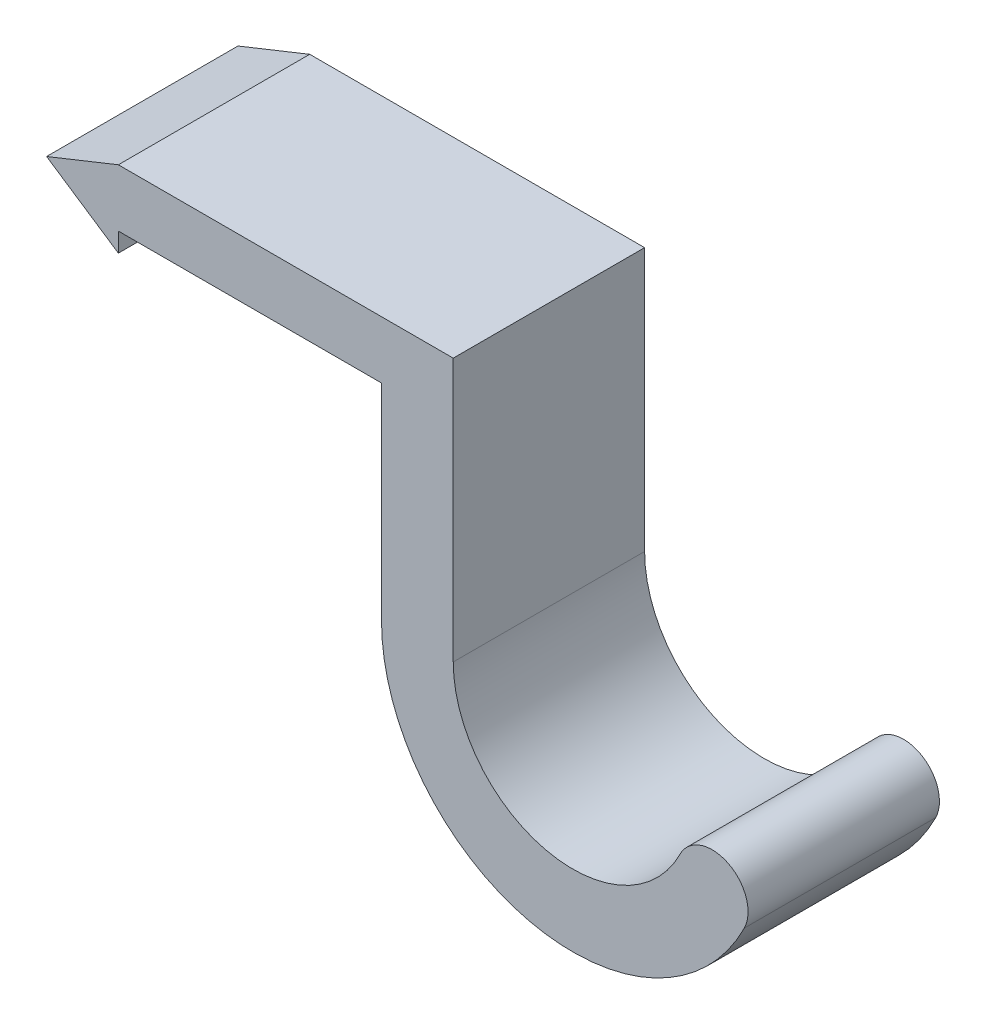
ISO-10303-21;
HEADER;
FILE_DESCRIPTION(('STEP AP214'),'2;1');
FILE_NAME('part.step','',(''),(''),'','','');
FILE_SCHEMA(('AUTOMOTIVE_DESIGN { 1 0 10303 214 1 1 1 1 }'));
ENDSEC;
DATA;
#1=APPLICATION_CONTEXT('core data for automotive mechanical design processes');
#2=APPLICATION_PROTOCOL_DEFINITION('international standard','automotive_design',2000,#1);
#3=PRODUCT_CONTEXT('',#1,'mechanical');
#4=PRODUCT('Part','Part','',(#3));
#5=PRODUCT_RELATED_PRODUCT_CATEGORY('part','',(#4));
#6=PRODUCT_DEFINITION_FORMATION('','',#4);
#7=PRODUCT_DEFINITION_CONTEXT('part definition',#1,'design');
#8=PRODUCT_DEFINITION('design','',#6,#7);
#9=PRODUCT_DEFINITION_SHAPE('','',#8);
#10=(LENGTH_UNIT() NAMED_UNIT(*) SI_UNIT(.MILLI.,.METRE.));
#11=(NAMED_UNIT(*) PLANE_ANGLE_UNIT() SI_UNIT($,.RADIAN.));
#12=(NAMED_UNIT(*) SI_UNIT($,.STERADIAN.) SOLID_ANGLE_UNIT());
#13=UNCERTAINTY_MEASURE_WITH_UNIT(LENGTH_MEASURE(1.E-05),#10,'distance_accuracy_value','');
#14=(GEOMETRIC_REPRESENTATION_CONTEXT(3) GLOBAL_UNCERTAINTY_ASSIGNED_CONTEXT((#13)) GLOBAL_UNIT_ASSIGNED_CONTEXT((#10,
#11,#12)) REPRESENTATION_CONTEXT('',''));
#15=CARTESIAN_POINT('',(0.,0.,0.));
#16=DIRECTION('',(0.,0.,1.));
#17=DIRECTION('',(1.,0.,0.));
#18=AXIS2_PLACEMENT_3D('',#15,#16,#17);
#19=CARTESIAN_POINT('',(0.,0.,40.));
#20=DIRECTION('',(-1.,0.,0.));
#21=DIRECTION('',(0.,-1.,0.));
#22=AXIS2_PLACEMENT_3D('',#19,#20,#21);
#23=PLANE('',#22);
#24=DIRECTION('',(0.,1.,0.));
#25=VECTOR('',#24,1.);
#26=CARTESIAN_POINT('',(0.,0.,0.));
#27=LINE('',#26,#25);
#28=CARTESIAN_POINT('',(0.,-4.,0.));
#29=VERTEX_POINT('',#28);
#30=CARTESIAN_POINT('',(0.,0.,0.));
#31=VERTEX_POINT('',#30);
#32=EDGE_CURVE('E145',#29,#31,#27,.T.);
#33=ORIENTED_EDGE('',*,*,#32,.T.);
#34=DIRECTION('',(0.,0.,-1.));
#35=VECTOR('',#34,1.);
#36=CARTESIAN_POINT('',(0.,0.,40.));
#37=LINE('',#36,#35);
#38=CARTESIAN_POINT('',(0.,0.,40.));
#39=VERTEX_POINT('',#38);
#40=EDGE_CURVE('E11',#39,#31,#37,.T.);
#41=ORIENTED_EDGE('',*,*,#40,.F.);
#42=DIRECTION('',(0.,1.,0.));
#43=VECTOR('',#42,1.);
#44=CARTESIAN_POINT('',(0.,0.,40.));
#45=LINE('',#44,#43);
#46=CARTESIAN_POINT('',(0.,-4.,40.));
#47=VERTEX_POINT('',#46);
#48=EDGE_CURVE('E163',#47,#39,#45,.T.);
#49=ORIENTED_EDGE('',*,*,#48,.F.);
#50=DIRECTION('',(0.,0.,-1.));
#51=VECTOR('',#50,1.);
#52=CARTESIAN_POINT('',(0.,-4.,40.));
#53=LINE('',#52,#51);
#54=EDGE_CURVE('E141',#47,#29,#53,.T.);
#55=ORIENTED_EDGE('',*,*,#54,.T.);
#56=EDGE_LOOP('',(#33,#41,#49,#55));
#57=FACE_BOUND('',#56,.T.);
#58=ADVANCED_FACE('F37',(#57),#23,.F.);
#59=CARTESIAN_POINT('',(0.,0.,40.));
#60=DIRECTION('',(0.,1.,0.));
#61=DIRECTION('',(0.,0.,1.));
#62=AXIS2_PLACEMENT_3D('',#59,#60,#61);
#63=PLANE('',#62);
#64=DIRECTION('',(1.,0.,0.));
#65=VECTOR('',#64,1.);
#66=CARTESIAN_POINT('',(0.,0.,0.));
#67=LINE('',#66,#65);
#68=CARTESIAN_POINT('',(55.,0.,0.));
#69=VERTEX_POINT('',#68);
#70=EDGE_CURVE('E148',#31,#69,#67,.T.);
#71=ORIENTED_EDGE('',*,*,#70,.T.);
#72=DIRECTION('',(0.,0.,-1.));
#73=VECTOR('',#72,1.);
#74=CARTESIAN_POINT('',(55.,0.,40.));
#75=LINE('',#74,#73);
#76=CARTESIAN_POINT('',(55.,0.,40.));
#77=VERTEX_POINT('',#76);
#78=EDGE_CURVE('E45',#77,#69,#75,.T.);
#79=ORIENTED_EDGE('',*,*,#78,.F.);
#80=DIRECTION('',(1.,0.,0.));
#81=VECTOR('',#80,1.);
#82=CARTESIAN_POINT('',(0.,0.,40.));
#83=LINE('',#82,#81);
#84=EDGE_CURVE('E102',#39,#77,#83,.T.);
#85=ORIENTED_EDGE('',*,*,#84,.F.);
#86=ORIENTED_EDGE('',*,*,#40,.T.);
#87=EDGE_LOOP('',(#71,#79,#85,#86));
#88=FACE_BOUND('',#87,.T.);
#89=ADVANCED_FACE('F212',(#88),#63,.F.);
#90=CARTESIAN_POINT('',(55.,0.,40.));
#91=DIRECTION('',(1.,0.,0.));
#92=DIRECTION('',(0.,0.,-1.));
#93=AXIS2_PLACEMENT_3D('',#90,#91,#92);
#94=PLANE('',#93);
#95=DIRECTION('',(0.,-1.,0.));
#96=VECTOR('',#95,1.);
#97=CARTESIAN_POINT('',(55.,0.,0.));
#98=LINE('',#97,#96);
#99=CARTESIAN_POINT('',(55.,-43.,0.));
#100=VERTEX_POINT('',#99);
#101=EDGE_CURVE('E150',#69,#100,#98,.T.);
#102=ORIENTED_EDGE('',*,*,#101,.T.);
#103=DIRECTION('',(0.,0.,-1.));
#104=VECTOR('',#103,1.);
#105=CARTESIAN_POINT('',(55.,-43.,40.));
#106=LINE('',#105,#104);
#107=CARTESIAN_POINT('',(55.,-43.,40.));
#108=VERTEX_POINT('',#107);
#109=EDGE_CURVE('E176',#108,#100,#106,.T.);
#110=ORIENTED_EDGE('',*,*,#109,.F.);
#111=DIRECTION('',(0.,-1.,0.));
#112=VECTOR('',#111,1.);
#113=CARTESIAN_POINT('',(55.,0.,40.));
#114=LINE('',#113,#112);
#115=EDGE_CURVE('E184',#77,#108,#114,.T.);
#116=ORIENTED_EDGE('',*,*,#115,.F.);
#117=ORIENTED_EDGE('',*,*,#78,.T.);
#118=EDGE_LOOP('',(#102,#110,#116,#117));
#119=FACE_BOUND('',#118,.T.);
#120=ADVANCED_FACE('F182',(#119),#94,.F.);
#121=CARTESIAN_POINT('',(95.,-43.,40.));
#122=DIRECTION('',(0.,0.,-1.));
#123=DIRECTION('',(-1.,0.,0.));
#124=AXIS2_PLACEMENT_3D('',#121,#122,#123);
#125=CYLINDRICAL_SURFACE('',#124,40.);
#126=CARTESIAN_POINT('',(95.,-43.,0.));
#127=DIRECTION('',(0.,0.,1.));
#128=DIRECTION('',(1.,0.,0.));
#129=AXIS2_PLACEMENT_3D('',#126,#127,#128);
#130=CIRCLE('',#129,40.);
#131=CARTESIAN_POINT('',(130.843778302859,-60.7545362365644,0.));
#132=VERTEX_POINT('',#131);
#133=EDGE_CURVE('E152',#100,#132,#130,.T.);
#134=ORIENTED_EDGE('',*,*,#133,.T.);
#135=DIRECTION('',(0.,0.,-1.));
#136=VECTOR('',#135,1.);
#137=CARTESIAN_POINT('',(130.843778302859,-60.7545362365644,40.));
#138=LINE('',#137,#136);
#139=CARTESIAN_POINT('',(130.843778302859,-60.7545362365644,40.));
#140=VERTEX_POINT('',#139);
#141=EDGE_CURVE('E173',#140,#132,#138,.T.);
#142=ORIENTED_EDGE('',*,*,#141,.F.);
#143=CARTESIAN_POINT('',(95.,-43.,40.));
#144=DIRECTION('',(0.,0.,1.));
#145=DIRECTION('',(1.,0.,0.));
#146=AXIS2_PLACEMENT_3D('',#143,#144,#145);
#147=CIRCLE('',#146,40.);
#148=EDGE_CURVE('E202',#108,#140,#147,.T.);
#149=ORIENTED_EDGE('',*,*,#148,.F.);
#150=ORIENTED_EDGE('',*,*,#109,.T.);
#151=EDGE_LOOP('',(#134,#142,#149,#150));
#152=FACE_BOUND('',#151,.T.);
#153=ADVANCED_FACE('F193',(#152),#125,.T.);
#154=CARTESIAN_POINT('',(124.123069871073,-57.4255606922085,40.));
#155=DIRECTION('',(0.,0.,-1.));
#156=DIRECTION('',(-1.,0.,0.));
#157=AXIS2_PLACEMENT_3D('',#154,#155,#156);
#158=CYLINDRICAL_SURFACE('',#157,7.50000000000001);
#159=CARTESIAN_POINT('',(124.123069871073,-57.4255606922085,0.));
#160=DIRECTION('',(0.,0.,1.));
#161=DIRECTION('',(-1.,0.,0.));
#162=AXIS2_PLACEMENT_3D('',#159,#160,#161);
#163=CIRCLE('',#162,7.50000000000001);
#164=CARTESIAN_POINT('',(117.402361439287,-54.0965851478527,0.));
#165=VERTEX_POINT('',#164);
#166=EDGE_CURVE('E154',#132,#165,#163,.T.);
#167=ORIENTED_EDGE('',*,*,#166,.T.);
#168=DIRECTION('',(0.,0.,-1.));
#169=VECTOR('',#168,1.);
#170=CARTESIAN_POINT('',(117.402361439287,-54.0965851478527,40.));
#171=LINE('',#170,#169);
#172=CARTESIAN_POINT('',(117.402361439287,-54.0965851478527,40.));
#173=VERTEX_POINT('',#172);
#174=EDGE_CURVE('E170',#173,#165,#171,.T.);
#175=ORIENTED_EDGE('',*,*,#174,.F.);
#176=CARTESIAN_POINT('',(124.123069871073,-57.4255606922085,40.));
#177=DIRECTION('',(0.,0.,1.));
#178=DIRECTION('',(-1.,0.,0.));
#179=AXIS2_PLACEMENT_3D('',#176,#177,#178);
#180=CIRCLE('',#179,7.50000000000001);
#181=EDGE_CURVE('E199',#140,#173,#180,.T.);
#182=ORIENTED_EDGE('',*,*,#181,.F.);
#183=ORIENTED_EDGE('',*,*,#141,.T.);
#184=EDGE_LOOP('',(#167,#175,#182,#183));
#185=FACE_BOUND('',#184,.T.);
#186=ADVANCED_FACE('F197',(#185),#158,.T.);
#187=CARTESIAN_POINT('',(95.,-43.,40.));
#188=DIRECTION('',(0.,0.,-1.));
#189=DIRECTION('',(-1.,0.,0.));
#190=AXIS2_PLACEMENT_3D('',#187,#188,#189);
#191=CYLINDRICAL_SURFACE('',#190,25.);
#192=CARTESIAN_POINT('',(95.,-43.,0.));
#193=DIRECTION('',(0.,0.,-1.));
#194=DIRECTION('',(1.,0.,0.));
#195=AXIS2_PLACEMENT_3D('',#192,#193,#194);
#196=CIRCLE('',#195,25.);
#197=CARTESIAN_POINT('',(70.,-43.,0.));
#198=VERTEX_POINT('',#197);
#199=EDGE_CURVE('E156',#165,#198,#196,.T.);
#200=ORIENTED_EDGE('',*,*,#199,.T.);
#201=DIRECTION('',(0.,0.,-1.));
#202=VECTOR('',#201,1.);
#203=CARTESIAN_POINT('',(70.,-43.,40.));
#204=LINE('',#203,#202);
#205=CARTESIAN_POINT('',(70.,-43.,40.));
#206=VERTEX_POINT('',#205);
#207=EDGE_CURVE('E167',#206,#198,#204,.T.);
#208=ORIENTED_EDGE('',*,*,#207,.F.);
#209=CARTESIAN_POINT('',(95.,-43.,40.));
#210=DIRECTION('',(0.,0.,-1.));
#211=DIRECTION('',(1.,0.,0.));
#212=AXIS2_PLACEMENT_3D('',#209,#210,#211);
#213=CIRCLE('',#212,25.);
#214=EDGE_CURVE('E201',#173,#206,#213,.T.);
#215=ORIENTED_EDGE('',*,*,#214,.F.);
#216=ORIENTED_EDGE('',*,*,#174,.T.);
#217=EDGE_LOOP('',(#200,#208,#215,#216));
#218=FACE_BOUND('',#217,.T.);
#219=ADVANCED_FACE('F224',(#218),#191,.F.);
#220=CARTESIAN_POINT('',(70.,12.,40.));
#221=DIRECTION('',(-1.,0.,0.));
#222=DIRECTION('',(0.,0.,1.));
#223=AXIS2_PLACEMENT_3D('',#220,#221,#222);
#224=PLANE('',#223);
#225=DIRECTION('',(0.,1.,0.));
#226=VECTOR('',#225,1.);
#227=CARTESIAN_POINT('',(70.,12.,0.));
#228=LINE('',#227,#226);
#229=CARTESIAN_POINT('',(70.,12.,0.));
#230=VERTEX_POINT('',#229);
#231=EDGE_CURVE('E158',#198,#230,#228,.T.);
#232=ORIENTED_EDGE('',*,*,#231,.T.);
#233=DIRECTION('',(0.,0.,-1.));
#234=VECTOR('',#233,1.);
#235=CARTESIAN_POINT('',(70.,12.,40.));
#236=LINE('',#235,#234);
#237=CARTESIAN_POINT('',(70.,12.,40.));
#238=VERTEX_POINT('',#237);
#239=EDGE_CURVE('E136',#238,#230,#236,.T.);
#240=ORIENTED_EDGE('',*,*,#239,.F.);
#241=DIRECTION('',(0.,1.,0.));
#242=VECTOR('',#241,1.);
#243=CARTESIAN_POINT('',(70.,12.,40.));
#244=LINE('',#243,#242);
#245=EDGE_CURVE('E127',#206,#238,#244,.T.);
#246=ORIENTED_EDGE('',*,*,#245,.F.);
#247=ORIENTED_EDGE('',*,*,#207,.T.);
#248=EDGE_LOOP('',(#232,#240,#246,#247));
#249=FACE_BOUND('',#248,.T.);
#250=ADVANCED_FACE('F227',(#249),#224,.F.);
#251=CARTESIAN_POINT('',(0.,12.,40.));
#252=DIRECTION('',(0.,-1.,0.));
#253=DIRECTION('',(0.,0.,-1.));
#254=AXIS2_PLACEMENT_3D('',#251,#252,#253);
#255=PLANE('',#254);
#256=DIRECTION('',(-1.,0.,0.));
#257=VECTOR('',#256,1.);
#258=CARTESIAN_POINT('',(0.,12.,0.));
#259=LINE('',#258,#257);
#260=CARTESIAN_POINT('',(0.,12.,0.));
#261=VERTEX_POINT('',#260);
#262=EDGE_CURVE('E135',#230,#261,#259,.T.);
#263=ORIENTED_EDGE('',*,*,#262,.T.);
#264=DIRECTION('',(0.,0.,-1.));
#265=VECTOR('',#264,1.);
#266=CARTESIAN_POINT('',(0.,12.,40.));
#267=LINE('',#266,#265);
#268=CARTESIAN_POINT('',(0.,12.,40.));
#269=VERTEX_POINT('',#268);
#270=EDGE_CURVE('E132',#269,#261,#267,.T.);
#271=ORIENTED_EDGE('',*,*,#270,.F.);
#272=DIRECTION('',(-1.,0.,0.));
#273=VECTOR('',#272,1.);
#274=CARTESIAN_POINT('',(0.,12.,40.));
#275=LINE('',#274,#273);
#276=EDGE_CURVE('E121',#238,#269,#275,.T.);
#277=ORIENTED_EDGE('',*,*,#276,.F.);
#278=ORIENTED_EDGE('',*,*,#239,.T.);
#279=EDGE_LOOP('',(#263,#271,#277,#278));
#280=FACE_BOUND('',#279,.T.);
#281=ADVANCED_FACE('F133',(#280),#255,.F.);
#282=CARTESIAN_POINT('',(-15.,6.,40.));
#283=DIRECTION('',(0.371390676354104,-0.928476690885259,0.));
#284=DIRECTION('',(0.928476690885259,0.371390676354104,0.));
#285=AXIS2_PLACEMENT_3D('',#282,#283,#284);
#286=PLANE('',#285);
#287=DIRECTION('',(-0.928476690885259,-0.371390676354104,0.));
#288=VECTOR('',#287,1.);
#289=CARTESIAN_POINT('',(-15.,6.,0.));
#290=LINE('',#289,#288);
#291=CARTESIAN_POINT('',(-15.,6.,0.));
#292=VERTEX_POINT('',#291);
#293=EDGE_CURVE('E88',#261,#292,#290,.T.);
#294=ORIENTED_EDGE('',*,*,#293,.T.);
#295=DIRECTION('',(0.,0.,-1.));
#296=VECTOR('',#295,1.);
#297=CARTESIAN_POINT('',(-15.,6.,40.));
#298=LINE('',#297,#296);
#299=CARTESIAN_POINT('',(-15.,6.,40.));
#300=VERTEX_POINT('',#299);
#301=EDGE_CURVE('E137',#300,#292,#298,.T.);
#302=ORIENTED_EDGE('',*,*,#301,.F.);
#303=DIRECTION('',(-0.928476690885259,-0.371390676354104,0.));
#304=VECTOR('',#303,1.);
#305=CARTESIAN_POINT('',(-15.,6.,40.));
#306=LINE('',#305,#304);
#307=EDGE_CURVE('E125',#269,#300,#306,.T.);
#308=ORIENTED_EDGE('',*,*,#307,.F.);
#309=ORIENTED_EDGE('',*,*,#270,.T.);
#310=EDGE_LOOP('',(#294,#302,#308,#309));
#311=FACE_BOUND('',#310,.T.);
#312=ADVANCED_FACE('F139',(#311),#286,.F.);
#313=CARTESIAN_POINT('',(0.,-4.,40.));
#314=DIRECTION('',(0.554700196225229,0.832050294337844,0.));
#315=DIRECTION('',(-0.832050294337844,0.554700196225229,0.));
#316=AXIS2_PLACEMENT_3D('',#313,#314,#315);
#317=PLANE('',#316);
#318=DIRECTION('',(0.832050294337844,-0.554700196225229,0.));
#319=VECTOR('',#318,1.);
#320=CARTESIAN_POINT('',(0.,-4.,0.));
#321=LINE('',#320,#319);
#322=EDGE_CURVE('E94',#292,#29,#321,.T.);
#323=ORIENTED_EDGE('',*,*,#322,.T.);
#324=ORIENTED_EDGE('',*,*,#54,.F.);
#325=DIRECTION('',(0.832050294337844,-0.554700196225229,0.));
#326=VECTOR('',#325,1.);
#327=CARTESIAN_POINT('',(0.,-4.,40.));
#328=LINE('',#327,#326);
#329=EDGE_CURVE('E53',#300,#47,#328,.T.);
#330=ORIENTED_EDGE('',*,*,#329,.F.);
#331=ORIENTED_EDGE('',*,*,#301,.T.);
#332=EDGE_LOOP('',(#323,#324,#330,#331));
#333=FACE_BOUND('',#332,.T.);
#334=ADVANCED_FACE('F236',(#333),#317,.F.);
#335=CARTESIAN_POINT('',(95.,-43.,40.));
#336=DIRECTION('',(0.,0.,1.));
#337=DIRECTION('',(1.,0.,0.));
#338=AXIS2_PLACEMENT_3D('',#335,#336,#337);
#339=PLANE('',#338);
#340=ORIENTED_EDGE('',*,*,#48,.T.);
#341=ORIENTED_EDGE('',*,*,#84,.T.);
#342=ORIENTED_EDGE('',*,*,#115,.T.);
#343=ORIENTED_EDGE('',*,*,#148,.T.);
#344=ORIENTED_EDGE('',*,*,#181,.T.);
#345=ORIENTED_EDGE('',*,*,#214,.T.);
#346=ORIENTED_EDGE('',*,*,#245,.T.);
#347=ORIENTED_EDGE('',*,*,#276,.T.);
#348=ORIENTED_EDGE('',*,*,#307,.T.);
#349=ORIENTED_EDGE('',*,*,#329,.T.);
#350=EDGE_LOOP('',(#340,#341,#342,#343,#344,#345,#346,#347,#348,#349));
#351=FACE_BOUND('',#350,.T.);
#352=ADVANCED_FACE('F123',(#351),#339,.T.);
#353=CARTESIAN_POINT('',(95.,-43.,0.));
#354=DIRECTION('',(0.,0.,1.));
#355=DIRECTION('',(1.,0.,0.));
#356=AXIS2_PLACEMENT_3D('',#353,#354,#355);
#357=PLANE('',#356);
#358=ORIENTED_EDGE('',*,*,#32,.F.);
#359=ORIENTED_EDGE('',*,*,#322,.F.);
#360=ORIENTED_EDGE('',*,*,#293,.F.);
#361=ORIENTED_EDGE('',*,*,#262,.F.);
#362=ORIENTED_EDGE('',*,*,#231,.F.);
#363=ORIENTED_EDGE('',*,*,#199,.F.);
#364=ORIENTED_EDGE('',*,*,#166,.F.);
#365=ORIENTED_EDGE('',*,*,#133,.F.);
#366=ORIENTED_EDGE('',*,*,#101,.F.);
#367=ORIENTED_EDGE('',*,*,#70,.F.);
#368=EDGE_LOOP('',(#358,#359,#360,#361,#362,#363,#364,#365,#366,#367));
#369=FACE_BOUND('',#368,.T.);
#370=ADVANCED_FACE('F188',(#369),#357,.F.);
#371=CLOSED_SHELL('',(#58,#89,#120,#153,#186,#219,#250,#281,#312,#334,#352,#370));
#372=MANIFOLD_SOLID_BREP('B2',#371);
#373=ADVANCED_BREP_SHAPE_REPRESENTATION('',(#18,#372),#14);
#374=SHAPE_DEFINITION_REPRESENTATION(#9,#373);
ENDSEC;
END-ISO-10303-21;
